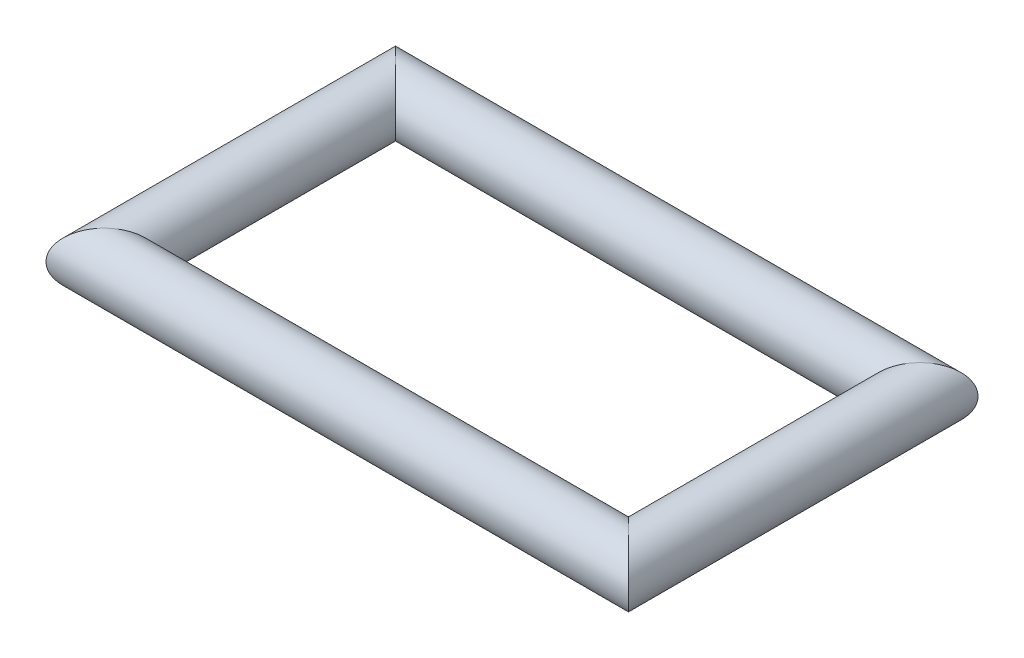
ISO-10303-21;
HEADER;
FILE_DESCRIPTION(('STEP AP214'),'2;1');
FILE_NAME('part.step','',(''),(''),'','','');
FILE_SCHEMA(('AUTOMOTIVE_DESIGN { 1 0 10303 214 1 1 1 1 }'));
ENDSEC;
DATA;
#1=APPLICATION_CONTEXT('core data for automotive mechanical design processes');
#2=APPLICATION_PROTOCOL_DEFINITION('international standard','automotive_design',2000,#1);
#3=PRODUCT_CONTEXT('',#1,'mechanical');
#4=PRODUCT('Part','Part','',(#3));
#5=PRODUCT_RELATED_PRODUCT_CATEGORY('part','',(#4));
#6=PRODUCT_DEFINITION_FORMATION('','',#4);
#7=PRODUCT_DEFINITION_CONTEXT('part definition',#1,'design');
#8=PRODUCT_DEFINITION('design','',#6,#7);
#9=PRODUCT_DEFINITION_SHAPE('','',#8);
#10=(LENGTH_UNIT() NAMED_UNIT(*) SI_UNIT(.MILLI.,.METRE.));
#11=(NAMED_UNIT(*) PLANE_ANGLE_UNIT() SI_UNIT($,.RADIAN.));
#12=(NAMED_UNIT(*) SI_UNIT($,.STERADIAN.) SOLID_ANGLE_UNIT());
#13=UNCERTAINTY_MEASURE_WITH_UNIT(LENGTH_MEASURE(1.E-05),#10,'distance_accuracy_value','');
#14=(GEOMETRIC_REPRESENTATION_CONTEXT(3) GLOBAL_UNCERTAINTY_ASSIGNED_CONTEXT((#13)) GLOBAL_UNIT_ASSIGNED_CONTEXT((#10,
#11,#12)) REPRESENTATION_CONTEXT('',''));
#15=CARTESIAN_POINT('',(0.,0.,0.));
#16=DIRECTION('',(0.,0.,1.));
#17=DIRECTION('',(1.,0.,0.));
#18=AXIS2_PLACEMENT_3D('',#15,#16,#17);
#19=CARTESIAN_POINT('',(-5.59999999999999,0.,25.));
#20=DIRECTION('',(1.,0.,0.));
#21=DIRECTION('',(0.,0.,-1.));
#22=AXIS2_PLACEMENT_3D('',#19,#20,#21);
#23=CYLINDRICAL_SURFACE('',#22,5.);
#24=CARTESIAN_POINT('',(0.,0.,25.));
#25=DIRECTION('',(0.707106781186547,0.,0.707106781186547));
#26=DIRECTION('',(-0.707106781186548,0.,0.707106781186548));
#27=AXIS2_PLACEMENT_3D('',#24,#25,#26);
#28=ELLIPSE('',#27,7.07106781186548,5.);
#29=CARTESIAN_POINT('',(-5.,0.,30.));
#30=VERTEX_POINT('',#29);
#31=EDGE_CURVE('E59',#30,#30,#28,.F.);
#32=ORIENTED_EDGE('',*,*,#31,.F.);
#33=EDGE_LOOP('',(#32));
#34=FACE_BOUND('',#33,.T.);
#35=CARTESIAN_POINT('',(90.,0.,25.));
#36=DIRECTION('',(0.707106781186548,0.,-0.707106781186548));
#37=DIRECTION('',(-0.707106781186548,0.,-0.707106781186548));
#38=AXIS2_PLACEMENT_3D('',#35,#36,#37);
#39=ELLIPSE('',#38,7.07106781186548,5.);
#40=CARTESIAN_POINT('',(85.,0.,20.));
#41=VERTEX_POINT('',#40);
#42=EDGE_CURVE('E50',#41,#41,#39,.F.);
#43=ORIENTED_EDGE('',*,*,#42,.T.);
#44=EDGE_LOOP('',(#43));
#45=FACE_BOUND('',#44,.T.);
#46=ADVANCED_FACE('F47',(#34,#45),#23,.T.);
#47=CARTESIAN_POINT('',(90.,0.,30.6));
#48=DIRECTION('',(0.,0.,-1.));
#49=DIRECTION('',(-1.,0.,0.));
#50=AXIS2_PLACEMENT_3D('',#47,#48,#49);
#51=CYLINDRICAL_SURFACE('',#50,5.);
#52=ORIENTED_EDGE('',*,*,#42,.F.);
#53=EDGE_LOOP('',(#52));
#54=FACE_BOUND('',#53,.T.);
#55=CARTESIAN_POINT('',(90.,0.,-25.));
#56=DIRECTION('',(-0.707106781186547,0.,-0.707106781186547));
#57=DIRECTION('',(-0.707106781186548,0.,0.707106781186548));
#58=AXIS2_PLACEMENT_3D('',#55,#56,#57);
#59=ELLIPSE('',#58,7.07106781186548,5.);
#60=CARTESIAN_POINT('',(85.,0.,-20.));
#61=VERTEX_POINT('',#60);
#62=EDGE_CURVE('E54',#61,#61,#59,.F.);
#63=ORIENTED_EDGE('',*,*,#62,.T.);
#64=EDGE_LOOP('',(#63));
#65=FACE_BOUND('',#64,.T.);
#66=ADVANCED_FACE('F68',(#54,#65),#51,.T.);
#67=CARTESIAN_POINT('',(0.,0.,-30.6));
#68=DIRECTION('',(0.,0.,1.));
#69=DIRECTION('',(1.,0.,0.));
#70=AXIS2_PLACEMENT_3D('',#67,#68,#69);
#71=CYLINDRICAL_SURFACE('',#70,5.);
#72=CARTESIAN_POINT('',(0.,0.,-25.));
#73=DIRECTION('',(-0.707106781186547,0.,0.707106781186547));
#74=DIRECTION('',(-0.707106781186548,0.,-0.707106781186548));
#75=AXIS2_PLACEMENT_3D('',#72,#73,#74);
#76=ELLIPSE('',#75,7.07106781186548,5.);
#77=CARTESIAN_POINT('',(-5.,0.,-30.));
#78=VERTEX_POINT('',#77);
#79=EDGE_CURVE('E11',#78,#78,#76,.F.);
#80=ORIENTED_EDGE('',*,*,#79,.F.);
#81=EDGE_LOOP('',(#80));
#82=FACE_BOUND('',#81,.T.);
#83=ORIENTED_EDGE('',*,*,#31,.T.);
#84=EDGE_LOOP('',(#83));
#85=FACE_BOUND('',#84,.T.);
#86=ADVANCED_FACE('F71',(#82,#85),#71,.T.);
#87=CARTESIAN_POINT('',(95.6,0.,-25.));
#88=DIRECTION('',(-1.,0.,0.));
#89=DIRECTION('',(0.,0.,1.));
#90=AXIS2_PLACEMENT_3D('',#87,#88,#89);
#91=CYLINDRICAL_SURFACE('',#90,5.);
#92=ORIENTED_EDGE('',*,*,#62,.F.);
#93=EDGE_LOOP('',(#92));
#94=FACE_BOUND('',#93,.T.);
#95=ORIENTED_EDGE('',*,*,#79,.T.);
#96=EDGE_LOOP('',(#95));
#97=FACE_BOUND('',#96,.T.);
#98=ADVANCED_FACE('F74',(#94,#97),#91,.T.);
#99=CLOSED_SHELL('',(#46,#66,#86,#98));
#100=MANIFOLD_SOLID_BREP('B2',#99);
#101=ADVANCED_BREP_SHAPE_REPRESENTATION('',(#18,#100),#14);
#102=SHAPE_DEFINITION_REPRESENTATION(#9,#101);
ENDSEC;
END-ISO-10303-21;
